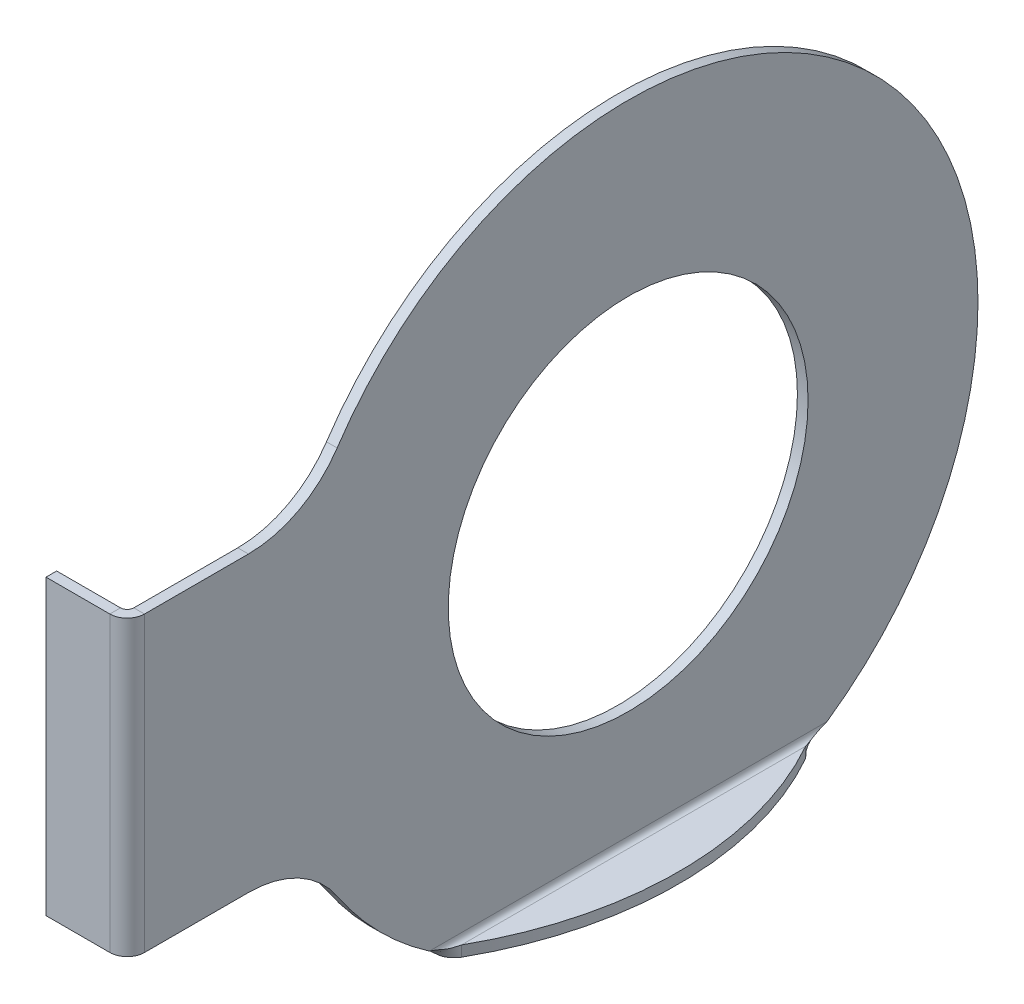
ISO-10303-21;
HEADER;
FILE_DESCRIPTION(('STEP AP214'),'2;1');
FILE_NAME('part.step','',(''),(''),'','','');
FILE_SCHEMA(('AUTOMOTIVE_DESIGN { 1 0 10303 214 1 1 1 1 }'));
ENDSEC;
DATA;
#1=APPLICATION_CONTEXT('core data for automotive mechanical design processes');
#2=APPLICATION_PROTOCOL_DEFINITION('international standard','automotive_design',2000,#1);
#3=PRODUCT_CONTEXT('',#1,'mechanical');
#4=PRODUCT('Part','Part','',(#3));
#5=PRODUCT_RELATED_PRODUCT_CATEGORY('part','',(#4));
#6=PRODUCT_DEFINITION_FORMATION('','',#4);
#7=PRODUCT_DEFINITION_CONTEXT('part definition',#1,'design');
#8=PRODUCT_DEFINITION('design','',#6,#7);
#9=PRODUCT_DEFINITION_SHAPE('','',#8);
#10=(LENGTH_UNIT() NAMED_UNIT(*) SI_UNIT(.MILLI.,.METRE.));
#11=(NAMED_UNIT(*) PLANE_ANGLE_UNIT() SI_UNIT($,.RADIAN.));
#12=(NAMED_UNIT(*) SI_UNIT($,.STERADIAN.) SOLID_ANGLE_UNIT());
#13=UNCERTAINTY_MEASURE_WITH_UNIT(LENGTH_MEASURE(1.E-05),#10,'distance_accuracy_value','');
#14=(GEOMETRIC_REPRESENTATION_CONTEXT(3) GLOBAL_UNCERTAINTY_ASSIGNED_CONTEXT((#13)) GLOBAL_UNIT_ASSIGNED_CONTEXT((#10,
#11,#12)) REPRESENTATION_CONTEXT('',''));
#15=CARTESIAN_POINT('',(0.,0.,0.));
#16=DIRECTION('',(0.,0.,1.));
#17=DIRECTION('',(1.,0.,0.));
#18=AXIS2_PLACEMENT_3D('',#15,#16,#17);
#19=CARTESIAN_POINT('',(0.,38.,56.9934206729163));
#20=DIRECTION('',(-1.,0.,0.));
#21=DIRECTION('',(0.,0.,1.));
#22=AXIS2_PLACEMENT_3D('',#19,#20,#21);
#23=PLANE('',#22);
#24=CARTESIAN_POINT('',(0.,0.,0.));
#25=DIRECTION('',(1.,0.,0.));
#26=DIRECTION('',(0.,0.,-1.));
#27=AXIS2_PLACEMENT_3D('',#24,#25,#26);
#28=CIRCLE('',#27,27.);
#29=CARTESIAN_POINT('',(0.,0.,-27.));
#30=VERTEX_POINT('',#29);
#31=EDGE_CURVE('E323',#30,#30,#28,.T.);
#32=ORIENTED_EDGE('',*,*,#31,.T.);
#33=EDGE_LOOP('',(#32));
#34=FACE_BOUND('',#33,.T.);
#35=DIRECTION('',(0.,0.,-1.));
#36=VECTOR('',#35,1.);
#37=CARTESIAN_POINT('',(0.,-22.,56.9934206729163));
#38=LINE('',#37,#36);
#39=CARTESIAN_POINT('',(0.,-22.,72.590498613805));
#40=VERTEX_POINT('',#39);
#41=CARTESIAN_POINT('',(0.,-22.,56.9934206729163));
#42=VERTEX_POINT('',#41);
#43=EDGE_CURVE('E73',#40,#42,#38,.T.);
#44=ORIENTED_EDGE('',*,*,#43,.F.);
#45=DIRECTION('',(0.,1.,0.));
#46=VECTOR('',#45,1.);
#47=CARTESIAN_POINT('',(0.,38.,72.590498613805));
#48=LINE('',#47,#46);
#49=CARTESIAN_POINT('',(0.,22.,72.590498613805));
#50=VERTEX_POINT('',#49);
#51=EDGE_CURVE('E65',#40,#50,#48,.T.);
#52=ORIENTED_EDGE('',*,*,#51,.T.);
#53=DIRECTION('',(0.,0.,1.));
#54=VECTOR('',#53,1.);
#55=CARTESIAN_POINT('',(0.,22.,56.9934206729163));
#56=LINE('',#55,#54);
#57=CARTESIAN_POINT('',(0.,22.,56.9934206729163));
#58=VERTEX_POINT('',#57);
#59=EDGE_CURVE('E81',#58,#50,#56,.T.);
#60=ORIENTED_EDGE('',*,*,#59,.F.);
#61=CARTESIAN_POINT('',(0.,38.,56.9934206729163));
#62=DIRECTION('',(-1.,0.,0.));
#63=DIRECTION('',(0.,0.,1.));
#64=AXIS2_PLACEMENT_3D('',#61,#62,#63);
#65=CIRCLE('',#64,16.);
#66=CARTESIAN_POINT('',(0.,29.1240875912409,43.6810888369066));
#67=VERTEX_POINT('',#66);
#68=EDGE_CURVE('E322',#67,#58,#65,.T.);
#69=ORIENTED_EDGE('',*,*,#68,.F.);
#70=CARTESIAN_POINT('',(0.,0.,0.));
#71=DIRECTION('',(1.,0.,0.));
#72=DIRECTION('',(0.,0.,-1.));
#73=AXIS2_PLACEMENT_3D('',#70,#71,#72);
#74=CIRCLE('',#73,52.5);
#75=CARTESIAN_POINT('',(0.,-43.1949484675754,-29.8403489738894));
#76=VERTEX_POINT('',#75);
#77=EDGE_CURVE('E338',#76,#67,#74,.T.);
#78=ORIENTED_EDGE('',*,*,#77,.F.);
#79=DIRECTION('',(0.,0.,1.));
#80=VECTOR('',#79,1.);
#81=CARTESIAN_POINT('',(0.,-43.1949484675745,56.9934206729171));
#82=LINE('',#81,#80);
#83=CARTESIAN_POINT('',(0.,-43.1949484675748,29.8403489738903));
#84=VERTEX_POINT('',#83);
#85=EDGE_CURVE('E393',#76,#84,#82,.T.);
#86=ORIENTED_EDGE('',*,*,#85,.T.);
#87=CARTESIAN_POINT('',(0.,-29.1240875912409,43.6810888369066));
#88=VERTEX_POINT('',#87);
#89=EDGE_CURVE('E330',#88,#84,#74,.T.);
#90=ORIENTED_EDGE('',*,*,#89,.F.);
#91=CARTESIAN_POINT('',(0.,-38.,56.9934206729163));
#92=DIRECTION('',(-1.,0.,0.));
#93=DIRECTION('',(0.,0.,-1.));
#94=AXIS2_PLACEMENT_3D('',#91,#92,#93);
#95=CIRCLE('',#94,16.);
#96=EDGE_CURVE('E336',#42,#88,#95,.T.);
#97=ORIENTED_EDGE('',*,*,#96,.F.);
#98=EDGE_LOOP('',(#44,#52,#60,#69,#78,#86,#90,#97));
#99=FACE_BOUND('',#98,.T.);
#100=ADVANCED_FACE('F56',(#34,#99),#23,.T.);
#101=CARTESIAN_POINT('',(1.6,0.,0.));
#102=DIRECTION('',(-1.,0.,0.));
#103=DIRECTION('',(0.,0.,1.));
#104=AXIS2_PLACEMENT_3D('',#101,#102,#103);
#105=CYLINDRICAL_SURFACE('',#104,52.5);
#106=CARTESIAN_POINT('',(1.6,-43.1949484675748,29.8403489738903));
#107=CARTESIAN_POINT('',(0.,-43.1949484675748,29.8403489738903));
#108=B_SPLINE_CURVE_WITH_KNOTS('',1,(#106,#107),.UNSPECIFIED.,.F.,.F.,(2,2),(0.,1.),.UNSPECIFIED.);
#109=CARTESIAN_POINT('',(1.6,-43.1949484675748,29.8403489738903));
#110=VERTEX_POINT('',#109);
#111=EDGE_CURVE('E310',#110,#84,#108,.T.);
#112=ORIENTED_EDGE('',*,*,#111,.F.);
#113=CARTESIAN_POINT('',(1.6,0.,0.));
#114=DIRECTION('',(1.,0.,0.));
#115=DIRECTION('',(0.,0.,-1.));
#116=AXIS2_PLACEMENT_3D('',#113,#114,#115);
#117=CIRCLE('',#116,52.5);
#118=CARTESIAN_POINT('',(1.6,-29.1240875912409,43.6810888369066));
#119=VERTEX_POINT('',#118);
#120=EDGE_CURVE('E343',#119,#110,#117,.T.);
#121=ORIENTED_EDGE('',*,*,#120,.F.);
#122=DIRECTION('',(-1.,0.,0.));
#123=VECTOR('',#122,1.);
#124=CARTESIAN_POINT('',(1.6,-29.1240875912409,43.6810888369066));
#125=LINE('',#124,#123);
#126=EDGE_CURVE('E342',#119,#88,#125,.T.);
#127=ORIENTED_EDGE('',*,*,#126,.T.);
#128=ORIENTED_EDGE('',*,*,#89,.T.);
#129=EDGE_LOOP('',(#112,#121,#127,#128));
#130=FACE_BOUND('',#129,.T.);
#131=ADVANCED_FACE('F381',(#130),#105,.T.);
#132=CARTESIAN_POINT('',(1.6,38.,56.9934206729163));
#133=DIRECTION('',(-1.,0.,0.));
#134=DIRECTION('',(0.,0.,1.));
#135=AXIS2_PLACEMENT_3D('',#132,#133,#134);
#136=PLANE('',#135);
#137=DIRECTION('',(0.,1.,0.));
#138=VECTOR('',#137,1.);
#139=CARTESIAN_POINT('',(1.6,38.,72.590498613805));
#140=LINE('',#139,#138);
#141=CARTESIAN_POINT('',(1.6,-22.,72.590498613805));
#142=VERTEX_POINT('',#141);
#143=CARTESIAN_POINT('',(1.6,22.,72.590498613805));
#144=VERTEX_POINT('',#143);
#145=EDGE_CURVE('E404',#142,#144,#140,.T.);
#146=ORIENTED_EDGE('',*,*,#145,.F.);
#147=DIRECTION('',(0.,0.,-1.));
#148=VECTOR('',#147,1.);
#149=CARTESIAN_POINT('',(1.6,-22.,56.9934206729163));
#150=LINE('',#149,#148);
#151=CARTESIAN_POINT('',(1.6,-22.,56.9934206729163));
#152=VERTEX_POINT('',#151);
#153=EDGE_CURVE('E60',#142,#152,#150,.T.);
#154=ORIENTED_EDGE('',*,*,#153,.T.);
#155=CARTESIAN_POINT('',(1.6,-38.,56.9934206729163));
#156=DIRECTION('',(-1.,0.,0.));
#157=DIRECTION('',(0.,0.,-1.));
#158=AXIS2_PLACEMENT_3D('',#155,#156,#157);
#159=CIRCLE('',#158,16.);
#160=EDGE_CURVE('E331',#152,#119,#159,.T.);
#161=ORIENTED_EDGE('',*,*,#160,.T.);
#162=ORIENTED_EDGE('',*,*,#120,.T.);
#163=DIRECTION('',(0.,0.,1.));
#164=VECTOR('',#163,1.);
#165=CARTESIAN_POINT('',(1.6,-43.1949484675745,56.9934206729171));
#166=LINE('',#165,#164);
#167=CARTESIAN_POINT('',(1.6,-43.1949484675754,-29.8403489738894));
#168=VERTEX_POINT('',#167);
#169=EDGE_CURVE('E351',#168,#110,#166,.T.);
#170=ORIENTED_EDGE('',*,*,#169,.F.);
#171=CARTESIAN_POINT('',(1.6,29.1240875912409,43.6810888369066));
#172=VERTEX_POINT('',#171);
#173=EDGE_CURVE('E333',#168,#172,#117,.T.);
#174=ORIENTED_EDGE('',*,*,#173,.T.);
#175=CARTESIAN_POINT('',(1.6,38.,56.9934206729163));
#176=DIRECTION('',(-1.,0.,0.));
#177=DIRECTION('',(0.,0.,1.));
#178=AXIS2_PLACEMENT_3D('',#175,#176,#177);
#179=CIRCLE('',#178,16.);
#180=CARTESIAN_POINT('',(1.6,22.,56.9934206729163));
#181=VERTEX_POINT('',#180);
#182=EDGE_CURVE('E326',#172,#181,#179,.T.);
#183=ORIENTED_EDGE('',*,*,#182,.T.);
#184=DIRECTION('',(0.,0.,1.));
#185=VECTOR('',#184,1.);
#186=CARTESIAN_POINT('',(1.6,22.,56.9934206729163));
#187=LINE('',#186,#185);
#188=EDGE_CURVE('E329',#181,#144,#187,.T.);
#189=ORIENTED_EDGE('',*,*,#188,.T.);
#190=EDGE_LOOP('',(#146,#154,#161,#162,#170,#174,#183,#189));
#191=FACE_BOUND('',#190,.T.);
#192=CARTESIAN_POINT('',(1.6,0.,0.));
#193=DIRECTION('',(1.,0.,0.));
#194=DIRECTION('',(0.,0.,-1.));
#195=AXIS2_PLACEMENT_3D('',#192,#193,#194);
#196=CIRCLE('',#195,27.);
#197=CARTESIAN_POINT('',(1.6,0.,-27.));
#198=VERTEX_POINT('',#197);
#199=EDGE_CURVE('E314',#198,#198,#196,.T.);
#200=ORIENTED_EDGE('',*,*,#199,.F.);
#201=EDGE_LOOP('',(#200));
#202=FACE_BOUND('',#201,.T.);
#203=ADVANCED_FACE('F383',(#191,#202),#136,.F.);
#204=CARTESIAN_POINT('',(1.6,38.,56.9934206729163));
#205=DIRECTION('',(-1.,0.,0.));
#206=DIRECTION('',(0.,0.,1.));
#207=AXIS2_PLACEMENT_3D('',#204,#205,#206);
#208=CYLINDRICAL_SURFACE('',#207,16.);
#209=ORIENTED_EDGE('',*,*,#68,.T.);
#210=DIRECTION('',(-1.,0.,0.));
#211=VECTOR('',#210,1.);
#212=CARTESIAN_POINT('',(1.6,22.,56.9934206729163));
#213=LINE('',#212,#211);
#214=EDGE_CURVE('E349',#181,#58,#213,.T.);
#215=ORIENTED_EDGE('',*,*,#214,.F.);
#216=ORIENTED_EDGE('',*,*,#182,.F.);
#217=DIRECTION('',(-1.,0.,0.));
#218=VECTOR('',#217,1.);
#219=CARTESIAN_POINT('',(1.6,29.1240875912409,43.6810888369066));
#220=LINE('',#219,#218);
#221=EDGE_CURVE('E339',#172,#67,#220,.T.);
#222=ORIENTED_EDGE('',*,*,#221,.T.);
#223=EDGE_LOOP('',(#209,#215,#216,#222));
#224=FACE_BOUND('',#223,.T.);
#225=ADVANCED_FACE('F382',(#224),#208,.F.);
#226=CARTESIAN_POINT('',(1.6,22.,56.9934206729163));
#227=DIRECTION('',(0.,-1.,0.));
#228=DIRECTION('',(0.,0.,-1.));
#229=AXIS2_PLACEMENT_3D('',#226,#227,#228);
#230=PLANE('',#229);
#231=DIRECTION('',(-1.,0.,0.));
#232=VECTOR('',#231,1.);
#233=CARTESIAN_POINT('',(1.6,22.,72.590498613805));
#234=LINE('',#233,#232);
#235=EDGE_CURVE('E424',#144,#50,#234,.T.);
#236=ORIENTED_EDGE('',*,*,#235,.F.);
#237=ORIENTED_EDGE('',*,*,#188,.F.);
#238=ORIENTED_EDGE('',*,*,#214,.T.);
#239=ORIENTED_EDGE('',*,*,#59,.T.);
#240=EDGE_LOOP('',(#236,#237,#238,#239));
#241=FACE_BOUND('',#240,.T.);
#242=ADVANCED_FACE('F535',(#241),#230,.F.);
#243=CARTESIAN_POINT('',(1.6,-22.,56.9934206729163));
#244=DIRECTION('',(0.,1.,0.));
#245=DIRECTION('',(0.,0.,1.));
#246=AXIS2_PLACEMENT_3D('',#243,#244,#245);
#247=PLANE('',#246);
#248=DIRECTION('',(1.,0.,0.));
#249=VECTOR('',#248,1.);
#250=CARTESIAN_POINT('',(1.6,-22.,72.590498613805));
#251=LINE('',#250,#249);
#252=EDGE_CURVE('E12',#40,#142,#251,.T.);
#253=ORIENTED_EDGE('',*,*,#252,.F.);
#254=ORIENTED_EDGE('',*,*,#43,.T.);
#255=DIRECTION('',(-1.,0.,0.));
#256=VECTOR('',#255,1.);
#257=CARTESIAN_POINT('',(1.6,-22.,56.9934206729163));
#258=LINE('',#257,#256);
#259=EDGE_CURVE('E346',#152,#42,#258,.T.);
#260=ORIENTED_EDGE('',*,*,#259,.F.);
#261=ORIENTED_EDGE('',*,*,#153,.F.);
#262=EDGE_LOOP('',(#253,#254,#260,#261));
#263=FACE_BOUND('',#262,.T.);
#264=ADVANCED_FACE('F58',(#263),#247,.F.);
#265=CARTESIAN_POINT('',(1.6,-38.,56.9934206729163));
#266=DIRECTION('',(-1.,0.,0.));
#267=DIRECTION('',(0.,0.,1.));
#268=AXIS2_PLACEMENT_3D('',#265,#266,#267);
#269=CYLINDRICAL_SURFACE('',#268,16.);
#270=ORIENTED_EDGE('',*,*,#96,.T.);
#271=ORIENTED_EDGE('',*,*,#126,.F.);
#272=ORIENTED_EDGE('',*,*,#160,.F.);
#273=ORIENTED_EDGE('',*,*,#259,.T.);
#274=EDGE_LOOP('',(#270,#271,#272,#273));
#275=FACE_BOUND('',#274,.T.);
#276=ADVANCED_FACE('F379',(#275),#269,.F.);
#277=CARTESIAN_POINT('',(0.,-43.1949484675754,-29.8403489738894));
#278=CARTESIAN_POINT('',(1.6,-43.1949484675754,-29.8403489738894));
#279=B_SPLINE_CURVE_WITH_KNOTS('',1,(#277,#278),.UNSPECIFIED.,.F.,.F.,(2,2),(0.,1.),.UNSPECIFIED.);
#280=EDGE_CURVE('E400',#76,#168,#279,.T.);
#281=ORIENTED_EDGE('',*,*,#280,.F.);
#282=ORIENTED_EDGE('',*,*,#77,.T.);
#283=ORIENTED_EDGE('',*,*,#221,.F.);
#284=ORIENTED_EDGE('',*,*,#173,.F.);
#285=EDGE_LOOP('',(#281,#282,#283,#284));
#286=FACE_BOUND('',#285,.T.);
#287=ADVANCED_FACE('F369',(#286),#105,.T.);
#288=CARTESIAN_POINT('',(1.6,0.,0.));
#289=DIRECTION('',(-1.,0.,0.));
#290=DIRECTION('',(0.,0.,1.));
#291=AXIS2_PLACEMENT_3D('',#288,#289,#290);
#292=CYLINDRICAL_SURFACE('',#291,27.);
#293=ORIENTED_EDGE('',*,*,#199,.T.);
#294=EDGE_LOOP('',(#293));
#295=FACE_BOUND('',#294,.T.);
#296=ORIENTED_EDGE('',*,*,#31,.F.);
#297=EDGE_LOOP('',(#296));
#298=FACE_BOUND('',#297,.T.);
#299=ADVANCED_FACE('F284',(#295,#298),#292,.F.);
#300=CARTESIAN_POINT('',(2.39999999999999,-45.5949484675754,-25.8265055247924));
#301=CARTESIAN_POINT('',(2.08581418695435,-45.5949484675754,-26.1610207443396));
#302=CARTESIAN_POINT('',(1.77180507753771,-45.5324828915794,-26.4954794329752));
#303=CARTESIAN_POINT('',(1.19131444710983,-45.2920357996256,-27.164453341158));
#304=CARTESIAN_POINT('',(0.925087872060189,-45.114148889331,-27.4989402952495));
#305=CARTESIAN_POINT('',(0.480799578244354,-44.6698605955152,-28.1679142034323));
#306=CARTESIAN_POINT('',(0.302912667949769,-44.4036340204656,-28.5024011575237));
#307=CARTESIAN_POINT('',(0.0624655759960359,-43.8231433900377,-29.1713750657066));
#308=CARTESIAN_POINT('',(0.,-43.5091342806211,-29.5058337543421));
#309=CARTESIAN_POINT('',(0.,-43.1949484675754,-29.8403489738894));
#310=CARTESIAN_POINT('',(2.4,-43.9949484675754,-25.8265055247924));
#311=CARTESIAN_POINT('',(2.2952785594616,-43.9949484675754,-26.1609978623053));
#312=CARTESIAN_POINT('',(2.19060169251257,-43.9741266089101,-26.4954794329752));
#313=CARTESIAN_POINT('',(1.99710481570328,-43.8939775782588,-27.1644533411581));
#314=CARTESIAN_POINT('',(1.90836262402006,-43.834681941494,-27.4989402952495));
#315=CARTESIAN_POINT('',(1.76026652608145,-43.6865858435553,-28.1679142034323));
#316=CARTESIAN_POINT('',(1.70097088931659,-43.5978436518721,-28.5024011575237));
#317=CARTESIAN_POINT('',(1.62082185866535,-43.4043467750628,-29.1713750657066));
#318=CARTESIAN_POINT('',(1.6,-43.2996699081138,-29.5058566363765));
#319=CARTESIAN_POINT('',(1.6,-43.1949484675754,-29.8403489738894));
#320=B_SPLINE_SURFACE_WITH_KNOTS('',1,3,((#300,#301,#302,#303,#304,#305,#306,#307,#308,#309),
(#310,#311,#312,#313,#314,#315,#316,#317,#318,#319)),.UNSPECIFIED.,.F.,.F.,.F.,(2,2),(4,2,2,2,
4),(0.,1.),(0.,0.25,0.5,0.75,1.),.UNSPECIFIED.);
#321=CARTESIAN_POINT('',(2.4,-43.9949484675754,-25.8265055247924));
#322=CARTESIAN_POINT('',(2.39999999999999,-45.5949484675754,-25.8265055247924));
#323=B_SPLINE_CURVE_WITH_KNOTS('',1,(#321,#322),.UNSPECIFIED.,.F.,.F.,(2,2),(0.,1.),.UNSPECIFIED.);
#324=CARTESIAN_POINT('',(2.40000000000001,-45.5949484675754,-25.8265055247924));
#325=VERTEX_POINT('',#324);
#326=CARTESIAN_POINT('',(2.4,-43.9949484675754,-25.8265055247924));
#327=VERTEX_POINT('',#326);
#328=EDGE_CURVE('E491',#325,#327,#323,.F.);
#329=CARTESIAN_POINT('',(2.39999999999999,-45.5949484675754,-25.8265055247924));
#330=CARTESIAN_POINT('',(2.08581418695435,-45.5949484675754,-26.1610207443396));
#331=CARTESIAN_POINT('',(1.77180507753771,-45.5324828915794,-26.4954794329752));
#332=CARTESIAN_POINT('',(1.19131444710983,-45.2920357996256,-27.164453341158));
#333=CARTESIAN_POINT('',(0.925087872060189,-45.114148889331,-27.4989402952495));
#334=CARTESIAN_POINT('',(0.480799578244354,-44.6698605955152,-28.1679142034323));
#335=CARTESIAN_POINT('',(0.302912667949769,-44.4036340204656,-28.5024011575237));
#336=CARTESIAN_POINT('',(0.0624655759960359,-43.8231433900377,-29.1713750657066));
#337=CARTESIAN_POINT('',(0.,-43.5091342806211,-29.5058337543421));
#338=CARTESIAN_POINT('',(0.,-43.1949484675754,-29.8403489738894));
#339=B_SPLINE_CURVE_WITH_KNOTS('',3,(#329,#330,#331,#332,#333,#334,#335,#336,#337,#338),
.UNSPECIFIED.,.F.,.F.,(4,2,2,2,4),(0.,0.25,0.5,0.75,1.),.UNSPECIFIED.);
#340=EDGE_CURVE('E495',#325,#76,#339,.T.);
#341=CARTESIAN_POINT('',(1.6,-43.1949484675754,-29.8403489738894));
#342=CARTESIAN_POINT('',(1.6,-43.2996699081138,-29.5058566363765));
#343=CARTESIAN_POINT('',(1.62082185866535,-43.4043467750628,-29.1713750657066));
#344=CARTESIAN_POINT('',(1.70097088931659,-43.5978436518721,-28.5024011575237));
#345=CARTESIAN_POINT('',(1.76026652608145,-43.6865858435553,-28.1679142034323));
#346=CARTESIAN_POINT('',(1.90836262402006,-43.834681941494,-27.4989402952495));
#347=CARTESIAN_POINT('',(1.99710481570328,-43.8939775782588,-27.1644533411581));
#348=CARTESIAN_POINT('',(2.19060169251257,-43.9741266089101,-26.4954794329752));
#349=CARTESIAN_POINT('',(2.2952785594616,-43.9949484675754,-26.1609978623053));
#350=CARTESIAN_POINT('',(2.4,-43.9949484675754,-25.8265055247924));
#351=B_SPLINE_CURVE_WITH_KNOTS('',3,(#341,#342,#343,#344,#345,#346,#347,#348,#349,#350),
.UNSPECIFIED.,.F.,.F.,(4,2,2,2,4),(0.,0.25,0.5,0.75,1.),.UNSPECIFIED.);
#352=EDGE_CURVE('E505',#327,#168,#351,.F.);
#353=ORIENTED_EDGE('',*,*,#328,.F.);
#354=ORIENTED_EDGE('',*,*,#340,.T.);
#355=ORIENTED_EDGE('',*,*,#280,.T.);
#356=ORIENTED_EDGE('',*,*,#352,.F.);
#357=EDGE_LOOP('',(#353,#354,#355,#356));
#358=FACE_BOUND('',#357,.T.);
#359=ADVANCED_FACE('F280',(#358),#320,.F.);
#360=CARTESIAN_POINT('',(0.,-43.1949484675748,29.8403489738903));
#361=CARTESIAN_POINT('',(0.,-43.5431796008379,29.4564046046059));
#362=CARTESIAN_POINT('',(0.076945603504657,-43.8911191876443,29.097279009771));
#363=CARTESIAN_POINT('',(0.297152798945562,-44.3647101950891,28.5956071010071));
#364=CARTESIAN_POINT('',(0.387796927702842,-44.514549797444,28.4345643052331));
#365=CARTESIAN_POINT('',(0.546428936659275,-44.7219885887356,28.2022718722931));
#366=CARTESIAN_POINT('',(0.603071730640237,-44.7882550972734,28.1263863547666));
#367=CARTESIAN_POINT('',(0.693182040119206,-44.8827478505569,28.014876018657));
#368=CARTESIAN_POINT('',(0.724075823840003,-44.9134281623926,27.9780922299839));
#369=CARTESIAN_POINT('',(0.771633470285655,-44.9581546442146,27.9234960320192));
#370=CARTESIAN_POINT('',(0.787688808778053,-44.9728478458135,27.9053938802052));
#371=CARTESIAN_POINT('',(0.812067091795537,-44.9945560562345,27.8783855237454));
#372=CARTESIAN_POINT('',(0.820242396363829,-45.0017368635636,27.869406883469));
#373=CARTESIAN_POINT('',(0.832578034329629,-45.0124241840744,27.8559751408697));
#374=CARTESIAN_POINT('',(0.83670202702908,-45.015972642658,27.8515039296392));
#375=CARTESIAN_POINT('',(0.844974048460047,-45.0230414325439,27.8425735797832));
#376=CARTESIAN_POINT('',(0.849935198854595,-45.0272470979085,27.8372440188581));
#377=CARTESIAN_POINT('',(1.06747909466519,-45.2106024905944,27.6043698173511));
#378=CARTESIAN_POINT('',(1.31354979964119,-45.3532113478243,27.3224610721057));
#379=CARTESIAN_POINT('',(1.83981127021119,-45.5454082704943,26.6534091340918));
#380=CARTESIAN_POINT('',(2.11986170524636,-45.5949484675749,26.2662804319928));
#381=CARTESIAN_POINT('',(2.39999999999999,-45.5949484675749,25.8265055247933));
#382=CARTESIAN_POINT('',(1.6,-43.1949484675748,29.8403489738903));
#383=CARTESIAN_POINT('',(1.6,-43.3110139294419,29.4564429158532));
#384=CARTESIAN_POINT('',(1.62564853450155,-43.4270053742647,29.097279009771));
#385=CARTESIAN_POINT('',(1.69905093298185,-43.5848690434129,28.5956071010071));
#386=CARTESIAN_POINT('',(1.72926564256761,-43.6348155775312,28.4345643052331));
#387=CARTESIAN_POINT('',(1.78214297888643,-43.7039618412951,28.2022718722931));
#388=CARTESIAN_POINT('',(1.80102391021341,-43.7260506774743,28.1263863547666));
#389=CARTESIAN_POINT('',(1.83106068003973,-43.7575482619022,28.014876018657));
#390=CARTESIAN_POINT('',(1.84135860794667,-43.7677750325141,27.9780922299839));
#391=CARTESIAN_POINT('',(1.85721115676188,-43.7826838597881,27.9234960320192));
#392=CARTESIAN_POINT('',(1.86256293625935,-43.7875815936544,27.9053938802052));
#393=CARTESIAN_POINT('',(1.87068903059851,-43.7948176637947,27.8783855237454));
#394=CARTESIAN_POINT('',(1.87341413212128,-43.7972112662378,27.869406883469));
#395=CARTESIAN_POINT('',(1.87752601144321,-43.800773706408,27.8559751408697));
#396=CARTESIAN_POINT('',(1.87890067567636,-43.8019565259359,27.8515039296392));
#397=CARTESIAN_POINT('',(1.88165801615335,-43.8043127892312,27.8425735797832));
#398=CARTESIAN_POINT('',(1.88331173295153,-43.8057146776861,27.8372440188581));
#399=CARTESIAN_POINT('',(1.9558263648884,-43.8668331419147,27.6043698173511));
#400=CARTESIAN_POINT('',(2.03784993321373,-43.914369427658,27.3224610721057));
#401=CARTESIAN_POINT('',(2.21327042340373,-43.978435068548,26.6534091340918));
#402=CARTESIAN_POINT('',(2.30662318542125,-43.9949484675749,26.2662681070786));
#403=CARTESIAN_POINT('',(2.4,-43.9949484675749,25.8265055247933));
#404=B_SPLINE_SURFACE_WITH_KNOTS('',1,3,((#360,#361,#362,#363,#364,#365,#366,#367,#368,#369,
#370,#371,#372,#373,#374,#375,#376,#377,#378,#379,#380,#381),(#382,#383,#384,#385,#386,#387,
#388,#389,#390,#391,#392,#393,#394,#395,#396,#397,#398,#399,#400,#401,#402,#403)),.UNSPECIFIED.,
.F.,.F.,.F.,(2,2),(4,2,2,2,2,2,2,2,2,2,4),(0.,1.),(0.,0.25,0.375,0.4375,0.46875,0.484375,
0.4921875,0.49609375,0.5,0.75,1.),.UNSPECIFIED.);
#405=CARTESIAN_POINT('',(0.,-43.1949484675748,29.8403489738903));
#406=CARTESIAN_POINT('',(0.,-43.5431796008379,29.4564046046059));
#407=CARTESIAN_POINT('',(0.076945603504657,-43.8911191876443,29.097279009771));
#408=CARTESIAN_POINT('',(0.297152798945562,-44.3647101950891,28.5956071010071));
#409=CARTESIAN_POINT('',(0.387796927702842,-44.514549797444,28.4345643052331));
#410=CARTESIAN_POINT('',(0.546428936659275,-44.7219885887356,28.2022718722931));
#411=CARTESIAN_POINT('',(0.603071730640237,-44.7882550972734,28.1263863547666));
#412=CARTESIAN_POINT('',(0.693182040119206,-44.8827478505569,28.014876018657));
#413=CARTESIAN_POINT('',(0.724075823840003,-44.9134281623926,27.9780922299839));
#414=CARTESIAN_POINT('',(0.771633470285655,-44.9581546442146,27.9234960320192));
#415=CARTESIAN_POINT('',(0.787688808778053,-44.9728478458135,27.9053938802052));
#416=CARTESIAN_POINT('',(0.812067091795537,-44.9945560562345,27.8783855237454));
#417=CARTESIAN_POINT('',(0.820242396363829,-45.0017368635636,27.869406883469));
#418=CARTESIAN_POINT('',(0.832578034329629,-45.0124241840744,27.8559751408697));
#419=CARTESIAN_POINT('',(0.83670202702908,-45.015972642658,27.8515039296392));
#420=CARTESIAN_POINT('',(0.844974048460047,-45.0230414325439,27.8425735797832));
#421=CARTESIAN_POINT('',(0.849935198854595,-45.0272470979085,27.8372440188581));
#422=CARTESIAN_POINT('',(1.06747909466519,-45.2106024905944,27.6043698173511));
#423=CARTESIAN_POINT('',(1.31354979964119,-45.3532113478243,27.3224610721057));
#424=CARTESIAN_POINT('',(1.83981127021119,-45.5454082704943,26.6534091340918));
#425=CARTESIAN_POINT('',(2.11986170524636,-45.5949484675749,26.2662804319928));
#426=CARTESIAN_POINT('',(2.39999999999999,-45.5949484675749,25.8265055247933));
#427=B_SPLINE_CURVE_WITH_KNOTS('',3,(#405,#406,#407,#408,#409,#410,#411,#412,#413,#414,#415,
#416,#417,#418,#419,#420,#421,#422,#423,#424,#425,#426),.UNSPECIFIED.,.F.,.F.,(4,2,2,2,2,2,2,2,
2,2,4),(0.,0.25,0.375,0.4375,0.46875,0.484375,0.4921875,0.49609375,0.5,0.75,1.),.UNSPECIFIED.);
#428=CARTESIAN_POINT('',(2.40000000000001,-45.5949484675748,25.8265055247933));
#429=VERTEX_POINT('',#428);
#430=EDGE_CURVE('E252',#84,#429,#427,.T.);
#431=CARTESIAN_POINT('',(2.39999999999999,-45.5949484675749,25.8265055247933));
#432=CARTESIAN_POINT('',(2.4,-43.9949484675749,25.8265055247933));
#433=B_SPLINE_CURVE_WITH_KNOTS('',1,(#431,#432),.UNSPECIFIED.,.F.,.F.,(2,2),(0.,1.),.UNSPECIFIED.);
#434=CARTESIAN_POINT('',(2.40000000000001,-43.9949484675748,25.8265055247933));
#435=VERTEX_POINT('',#434);
#436=EDGE_CURVE('E492',#435,#429,#433,.F.);
#437=CARTESIAN_POINT('',(2.4,-43.9949484675749,25.8265055247933));
#438=CARTESIAN_POINT('',(2.30662318542125,-43.9949484675749,26.2662681070786));
#439=CARTESIAN_POINT('',(2.21327042340373,-43.978435068548,26.6534091340918));
#440=CARTESIAN_POINT('',(2.03784993321373,-43.914369427658,27.3224610721057));
#441=CARTESIAN_POINT('',(1.9558263648884,-43.8668331419147,27.6043698173511));
#442=CARTESIAN_POINT('',(1.88331173295153,-43.8057146776861,27.8372440188581));
#443=CARTESIAN_POINT('',(1.88165801615335,-43.8043127892312,27.8425735797832));
#444=CARTESIAN_POINT('',(1.87890067567636,-43.8019565259359,27.8515039296392));
#445=CARTESIAN_POINT('',(1.87752601144321,-43.800773706408,27.8559751408697));
#446=CARTESIAN_POINT('',(1.87341413212128,-43.7972112662378,27.869406883469));
#447=CARTESIAN_POINT('',(1.87068903059851,-43.7948176637947,27.8783855237454));
#448=CARTESIAN_POINT('',(1.86256293625935,-43.7875815936544,27.9053938802052));
#449=CARTESIAN_POINT('',(1.85721115676188,-43.7826838597881,27.9234960320192));
#450=CARTESIAN_POINT('',(1.84135860794667,-43.7677750325141,27.9780922299839));
#451=CARTESIAN_POINT('',(1.83106068003973,-43.7575482619022,28.014876018657));
#452=CARTESIAN_POINT('',(1.80102391021341,-43.7260506774743,28.1263863547666));
#453=CARTESIAN_POINT('',(1.78214297888643,-43.7039618412951,28.2022718722931));
#454=CARTESIAN_POINT('',(1.72926564256761,-43.6348155775312,28.4345643052331));
#455=CARTESIAN_POINT('',(1.69905093298185,-43.5848690434129,28.5956071010071));
#456=CARTESIAN_POINT('',(1.62564853450155,-43.4270053742647,29.097279009771));
#457=CARTESIAN_POINT('',(1.6,-43.3110139294419,29.4564429158532));
#458=CARTESIAN_POINT('',(1.6,-43.1949484675748,29.8403489738903));
#459=B_SPLINE_CURVE_WITH_KNOTS('',3,(#437,#438,#439,#440,#441,#442,#443,#444,#445,#446,#447,
#448,#449,#450,#451,#452,#453,#454,#455,#456,#457,#458),.UNSPECIFIED.,.F.,.F.,(4,2,2,2,2,2,2,2,
2,2,4),(0.,0.25,0.5,0.50390625,0.5078125,0.515625,0.53125,0.5625,0.625,0.75,1.),.UNSPECIFIED.);
#460=EDGE_CURVE('E245',#110,#435,#459,.F.);
#461=ORIENTED_EDGE('',*,*,#430,.T.);
#462=ORIENTED_EDGE('',*,*,#436,.F.);
#463=ORIENTED_EDGE('',*,*,#460,.F.);
#464=ORIENTED_EDGE('',*,*,#111,.T.);
#465=EDGE_LOOP('',(#461,#462,#463,#464));
#466=FACE_BOUND('',#465,.T.);
#467=ADVANCED_FACE('F220',(#466),#404,.F.);
#468=CARTESIAN_POINT('',(2.4,-43.1949484675745,59.7550186540919));
#469=DIRECTION('',(0.,0.,-1.));
#470=DIRECTION('',(0.,1.,0.));
#471=AXIS2_PLACEMENT_3D('',#468,#469,#470);
#472=CYLINDRICAL_SURFACE('',#471,0.8);
#473=ORIENTED_EDGE('',*,*,#169,.T.);
#474=ORIENTED_EDGE('',*,*,#460,.T.);
#475=DIRECTION('',(0.,0.,1.));
#476=VECTOR('',#475,1.);
#477=CARTESIAN_POINT('',(2.40000000000001,-43.9949484675745,56.9934206729171));
#478=LINE('',#477,#476);
#479=EDGE_CURVE('E496',#327,#435,#478,.T.);
#480=ORIENTED_EDGE('',*,*,#479,.F.);
#481=ORIENTED_EDGE('',*,*,#352,.T.);
#482=EDGE_LOOP('',(#473,#474,#480,#481));
#483=FACE_BOUND('',#482,.T.);
#484=ADVANCED_FACE('F209',(#483),#472,.F.);
#485=CARTESIAN_POINT('',(2.4,-43.1949484675745,59.7550186540919));
#486=DIRECTION('',(0.,0.,-1.));
#487=DIRECTION('',(0.,1.,0.));
#488=AXIS2_PLACEMENT_3D('',#485,#486,#487);
#489=CYLINDRICAL_SURFACE('',#488,2.4);
#490=ORIENTED_EDGE('',*,*,#85,.F.);
#491=ORIENTED_EDGE('',*,*,#340,.F.);
#492=DIRECTION('',(0.,0.,1.));
#493=VECTOR('',#492,1.);
#494=CARTESIAN_POINT('',(2.40000000000001,-45.5949484675745,56.9934206729172));
#495=LINE('',#494,#493);
#496=EDGE_CURVE('E196',#325,#429,#495,.T.);
#497=ORIENTED_EDGE('',*,*,#496,.T.);
#498=ORIENTED_EDGE('',*,*,#430,.F.);
#499=EDGE_LOOP('',(#490,#491,#497,#498));
#500=FACE_BOUND('',#499,.T.);
#501=ADVANCED_FACE('F219',(#500),#489,.T.);
#502=CARTESIAN_POINT('',(-81.3082225904463,-43.9949484675748,56.9934206729171));
#503=DIRECTION('',(0.,-1.,0.));
#504=DIRECTION('',(0.,0.,1.));
#505=AXIS2_PLACEMENT_3D('',#502,#503,#504);
#506=PLANE('',#505);
#507=CARTESIAN_POINT('',(-43.3082225904469,-43.9949484675753,4.58571788771344E-13));
#508=DIRECTION('',(0.,1.,0.));
#509=DIRECTION('',(0.,0.,-1.));
#510=AXIS2_PLACEMENT_3D('',#507,#508,#509);
#511=CIRCLE('',#510,52.5);
#512=EDGE_CURVE('E487',#435,#327,#511,.T.);
#513=ORIENTED_EDGE('',*,*,#512,.T.);
#514=ORIENTED_EDGE('',*,*,#479,.T.);
#515=EDGE_LOOP('',(#513,#514));
#516=FACE_BOUND('',#515,.T.);
#517=ADVANCED_FACE('F470',(#516),#506,.F.);
#518=CARTESIAN_POINT('',(-43.3082225904469,-43.9949484675753,4.58571788771344E-13));
#519=DIRECTION('',(0.,-1.,0.));
#520=DIRECTION('',(0.,0.,1.));
#521=AXIS2_PLACEMENT_3D('',#518,#519,#520);
#522=CYLINDRICAL_SURFACE('',#521,52.5);
#523=ORIENTED_EDGE('',*,*,#512,.F.);
#524=ORIENTED_EDGE('',*,*,#436,.T.);
#525=CARTESIAN_POINT('',(-43.3082225904469,-45.5949484675753,4.75314232417645E-13));
#526=DIRECTION('',(0.,1.,0.));
#527=DIRECTION('',(0.,0.,-1.));
#528=AXIS2_PLACEMENT_3D('',#525,#526,#527);
#529=CIRCLE('',#528,52.5);
#530=EDGE_CURVE('E490',#429,#325,#529,.T.);
#531=ORIENTED_EDGE('',*,*,#530,.T.);
#532=ORIENTED_EDGE('',*,*,#328,.T.);
#533=EDGE_LOOP('',(#523,#524,#531,#532));
#534=FACE_BOUND('',#533,.T.);
#535=ADVANCED_FACE('F461',(#534),#522,.T.);
#536=CARTESIAN_POINT('',(-81.3082225904463,-45.5949484675748,56.9934206729172));
#537=DIRECTION('',(0.,-1.,0.));
#538=DIRECTION('',(0.,0.,1.));
#539=AXIS2_PLACEMENT_3D('',#536,#537,#538);
#540=PLANE('',#539);
#541=ORIENTED_EDGE('',*,*,#496,.F.);
#542=ORIENTED_EDGE('',*,*,#530,.F.);
#543=EDGE_LOOP('',(#541,#542));
#544=FACE_BOUND('',#543,.T.);
#545=ADVANCED_FACE('F222',(#544),#540,.T.);
#546=CARTESIAN_POINT('',(-1.,-22.,72.590498613805));
#547=DIRECTION('',(0.,-1.,0.));
#548=DIRECTION('',(0.,0.,-1.));
#549=AXIS2_PLACEMENT_3D('',#546,#547,#548);
#550=PLANE('',#549);
#551=DIRECTION('',(0.,0.,1.));
#552=VECTOR('',#551,1.);
#553=CARTESIAN_POINT('',(-1.00000000000001,-22.,75.190498613805));
#554=LINE('',#553,#552);
#555=CARTESIAN_POINT('',(-1.00000000000001,-22.,73.590498613805));
#556=VERTEX_POINT('',#555);
#557=CARTESIAN_POINT('',(-1.00000000000002,-22.,75.190498613805));
#558=VERTEX_POINT('',#557);
#559=EDGE_CURVE('E443',#556,#558,#554,.T.);
#560=ORIENTED_EDGE('',*,*,#559,.F.);
#561=CARTESIAN_POINT('',(-1.,-22.,72.590498613805));
#562=DIRECTION('',(0.,-1.,0.));
#563=DIRECTION('',(0.,0.,-1.));
#564=AXIS2_PLACEMENT_3D('',#561,#562,#563);
#565=CIRCLE('',#564,1.);
#566=EDGE_CURVE('E197',#556,#40,#565,.F.);
#567=ORIENTED_EDGE('',*,*,#566,.T.);
#568=ORIENTED_EDGE('',*,*,#252,.T.);
#569=CARTESIAN_POINT('',(-1.,-22.,72.590498613805));
#570=DIRECTION('',(0.,1.,0.));
#571=DIRECTION('',(0.,0.,1.));
#572=AXIS2_PLACEMENT_3D('',#569,#570,#571);
#573=CIRCLE('',#572,2.6);
#574=EDGE_CURVE('E189',#558,#142,#573,.T.);
#575=ORIENTED_EDGE('',*,*,#574,.F.);
#576=EDGE_LOOP('',(#560,#567,#568,#575));
#577=FACE_BOUND('',#576,.T.);
#578=ADVANCED_FACE('F429',(#577),#550,.T.);
#579=CARTESIAN_POINT('',(-1.,22.,72.590498613805));
#580=DIRECTION('',(0.,1.,0.));
#581=DIRECTION('',(0.,0.,1.));
#582=AXIS2_PLACEMENT_3D('',#579,#580,#581);
#583=PLANE('',#582);
#584=CARTESIAN_POINT('',(-1.,22.,72.590498613805));
#585=DIRECTION('',(0.,-1.,0.));
#586=DIRECTION('',(0.,0.,-1.));
#587=AXIS2_PLACEMENT_3D('',#584,#585,#586);
#588=CIRCLE('',#587,1.);
#589=CARTESIAN_POINT('',(-1.00000000000001,22.,73.590498613805));
#590=VERTEX_POINT('',#589);
#591=EDGE_CURVE('E193',#50,#590,#588,.T.);
#592=ORIENTED_EDGE('',*,*,#591,.T.);
#593=DIRECTION('',(0.,0.,-1.));
#594=VECTOR('',#593,1.);
#595=CARTESIAN_POINT('',(-1.00000000000001,22.,75.190498613805));
#596=LINE('',#595,#594);
#597=CARTESIAN_POINT('',(-1.00000000000001,22.,75.190498613805));
#598=VERTEX_POINT('',#597);
#599=EDGE_CURVE('E167',#598,#590,#596,.T.);
#600=ORIENTED_EDGE('',*,*,#599,.F.);
#601=CARTESIAN_POINT('',(-1.,22.,72.590498613805));
#602=DIRECTION('',(0.,-1.,0.));
#603=DIRECTION('',(0.,0.,-1.));
#604=AXIS2_PLACEMENT_3D('',#601,#602,#603);
#605=CIRCLE('',#604,2.6);
#606=EDGE_CURVE('E192',#144,#598,#605,.T.);
#607=ORIENTED_EDGE('',*,*,#606,.F.);
#608=ORIENTED_EDGE('',*,*,#235,.T.);
#609=EDGE_LOOP('',(#592,#600,#607,#608));
#610=FACE_BOUND('',#609,.T.);
#611=ADVANCED_FACE('F450',(#610),#583,.T.);
#612=CARTESIAN_POINT('',(-1.,44.1197731132525,72.590498613805));
#613=DIRECTION('',(0.,-1.,0.));
#614=DIRECTION('',(0.,0.,-1.));
#615=AXIS2_PLACEMENT_3D('',#612,#613,#614);
#616=CYLINDRICAL_SURFACE('',#615,2.6);
#617=ORIENTED_EDGE('',*,*,#145,.T.);
#618=ORIENTED_EDGE('',*,*,#606,.T.);
#619=DIRECTION('',(0.,1.,0.));
#620=VECTOR('',#619,1.);
#621=CARTESIAN_POINT('',(-1.00000000000001,38.,75.190498613805));
#622=LINE('',#621,#620);
#623=EDGE_CURVE('E433',#558,#598,#622,.T.);
#624=ORIENTED_EDGE('',*,*,#623,.F.);
#625=ORIENTED_EDGE('',*,*,#574,.T.);
#626=EDGE_LOOP('',(#617,#618,#624,#625));
#627=FACE_BOUND('',#626,.T.);
#628=ADVANCED_FACE('F432',(#627),#616,.T.);
#629=CARTESIAN_POINT('',(-1.,44.1197731132525,72.590498613805));
#630=DIRECTION('',(0.,-1.,0.));
#631=DIRECTION('',(0.,0.,-1.));
#632=AXIS2_PLACEMENT_3D('',#629,#630,#631);
#633=CYLINDRICAL_SURFACE('',#632,1.);
#634=ORIENTED_EDGE('',*,*,#51,.F.);
#635=ORIENTED_EDGE('',*,*,#566,.F.);
#636=DIRECTION('',(0.,1.,0.));
#637=VECTOR('',#636,1.);
#638=CARTESIAN_POINT('',(-1.00000000000001,38.,73.590498613805));
#639=LINE('',#638,#637);
#640=EDGE_CURVE('E184',#556,#590,#639,.T.);
#641=ORIENTED_EDGE('',*,*,#640,.T.);
#642=ORIENTED_EDGE('',*,*,#591,.F.);
#643=EDGE_LOOP('',(#634,#635,#641,#642));
#644=FACE_BOUND('',#643,.T.);
#645=ADVANCED_FACE('F454',(#644),#633,.F.);
#646=CARTESIAN_POINT('',(-10.5820679979642,-22.,75.1904986138049));
#647=DIRECTION('',(1.,0.,0.));
#648=DIRECTION('',(0.,0.,-1.));
#649=AXIS2_PLACEMENT_3D('',#646,#647,#648);
#650=PLANE('',#649);
#651=DIRECTION('',(0.,-1.,0.));
#652=VECTOR('',#651,1.);
#653=CARTESIAN_POINT('',(-10.5820679979642,-22.,73.5904986138049));
#654=LINE('',#653,#652);
#655=CARTESIAN_POINT('',(-10.5820679979642,22.,73.5904986138049));
#656=VERTEX_POINT('',#655);
#657=CARTESIAN_POINT('',(-10.5820679979642,-22.,73.5904986138049));
#658=VERTEX_POINT('',#657);
#659=EDGE_CURVE('E177',#656,#658,#654,.T.);
#660=ORIENTED_EDGE('',*,*,#659,.T.);
#661=DIRECTION('',(0.,0.,-1.));
#662=VECTOR('',#661,1.);
#663=CARTESIAN_POINT('',(-10.5820679979642,-22.,75.1904986138049));
#664=LINE('',#663,#662);
#665=CARTESIAN_POINT('',(-10.5820679979642,-22.,75.1904986138049));
#666=VERTEX_POINT('',#665);
#667=EDGE_CURVE('E200',#666,#658,#664,.T.);
#668=ORIENTED_EDGE('',*,*,#667,.F.);
#669=DIRECTION('',(0.,-1.,0.));
#670=VECTOR('',#669,1.);
#671=CARTESIAN_POINT('',(-10.5820679979642,-22.,75.1904986138049));
#672=LINE('',#671,#670);
#673=CARTESIAN_POINT('',(-10.5820679979642,22.,75.1904986138049));
#674=VERTEX_POINT('',#673);
#675=EDGE_CURVE('E179',#674,#666,#672,.T.);
#676=ORIENTED_EDGE('',*,*,#675,.F.);
#677=DIRECTION('',(0.,0.,-1.));
#678=VECTOR('',#677,1.);
#679=CARTESIAN_POINT('',(-10.5820679979642,22.,75.1904986138049));
#680=LINE('',#679,#678);
#681=EDGE_CURVE('E164',#674,#656,#680,.T.);
#682=ORIENTED_EDGE('',*,*,#681,.T.);
#683=EDGE_LOOP('',(#660,#668,#676,#682));
#684=FACE_BOUND('',#683,.T.);
#685=ADVANCED_FACE('F175',(#684),#650,.F.);
#686=CARTESIAN_POINT('',(17.4245113291195,38.,75.190498613805));
#687=DIRECTION('',(0.,0.,-1.));
#688=DIRECTION('',(-1.,0.,0.));
#689=AXIS2_PLACEMENT_3D('',#686,#687,#688);
#690=PLANE('',#689);
#691=DIRECTION('',(1.,0.,0.));
#692=VECTOR('',#691,1.);
#693=CARTESIAN_POINT('',(17.4245113291195,-22.,75.190498613805));
#694=LINE('',#693,#692);
#695=EDGE_CURVE('E180',#666,#558,#694,.T.);
#696=ORIENTED_EDGE('',*,*,#695,.T.);
#697=ORIENTED_EDGE('',*,*,#623,.T.);
#698=DIRECTION('',(-1.,0.,0.));
#699=VECTOR('',#698,1.);
#700=CARTESIAN_POINT('',(17.4245113291195,22.,75.190498613805));
#701=LINE('',#700,#699);
#702=EDGE_CURVE('E436',#598,#674,#701,.T.);
#703=ORIENTED_EDGE('',*,*,#702,.T.);
#704=ORIENTED_EDGE('',*,*,#675,.T.);
#705=EDGE_LOOP('',(#696,#697,#703,#704));
#706=FACE_BOUND('',#705,.T.);
#707=ADVANCED_FACE('F448',(#706),#690,.F.);
#708=CARTESIAN_POINT('',(17.4245113291195,22.,75.190498613805));
#709=DIRECTION('',(0.,-1.,0.));
#710=DIRECTION('',(1.,0.,0.));
#711=AXIS2_PLACEMENT_3D('',#708,#709,#710);
#712=PLANE('',#711);
#713=ORIENTED_EDGE('',*,*,#702,.F.);
#714=ORIENTED_EDGE('',*,*,#599,.T.);
#715=DIRECTION('',(-1.,0.,0.));
#716=VECTOR('',#715,1.);
#717=CARTESIAN_POINT('',(17.4245113291195,22.,73.590498613805));
#718=LINE('',#717,#716);
#719=EDGE_CURVE('E160',#590,#656,#718,.T.);
#720=ORIENTED_EDGE('',*,*,#719,.T.);
#721=ORIENTED_EDGE('',*,*,#681,.F.);
#722=EDGE_LOOP('',(#713,#714,#720,#721));
#723=FACE_BOUND('',#722,.T.);
#724=ADVANCED_FACE('F163',(#723),#712,.F.);
#725=CARTESIAN_POINT('',(17.4245113291195,38.,73.590498613805));
#726=DIRECTION('',(0.,0.,-1.));
#727=DIRECTION('',(-1.,0.,0.));
#728=AXIS2_PLACEMENT_3D('',#725,#726,#727);
#729=PLANE('',#728);
#730=ORIENTED_EDGE('',*,*,#640,.F.);
#731=DIRECTION('',(1.,0.,0.));
#732=VECTOR('',#731,1.);
#733=CARTESIAN_POINT('',(17.4245113291195,-22.,73.590498613805));
#734=LINE('',#733,#732);
#735=EDGE_CURVE('E172',#658,#556,#734,.T.);
#736=ORIENTED_EDGE('',*,*,#735,.F.);
#737=ORIENTED_EDGE('',*,*,#659,.F.);
#738=ORIENTED_EDGE('',*,*,#719,.F.);
#739=EDGE_LOOP('',(#730,#736,#737,#738));
#740=FACE_BOUND('',#739,.T.);
#741=ADVANCED_FACE('F183',(#740),#729,.T.);
#742=CARTESIAN_POINT('',(17.4245113291195,-22.,75.190498613805));
#743=DIRECTION('',(0.,1.,0.));
#744=DIRECTION('',(-1.,0.,0.));
#745=AXIS2_PLACEMENT_3D('',#742,#743,#744);
#746=PLANE('',#745);
#747=ORIENTED_EDGE('',*,*,#735,.T.);
#748=ORIENTED_EDGE('',*,*,#559,.T.);
#749=ORIENTED_EDGE('',*,*,#695,.F.);
#750=ORIENTED_EDGE('',*,*,#667,.T.);
#751=EDGE_LOOP('',(#747,#748,#749,#750));
#752=FACE_BOUND('',#751,.T.);
#753=ADVANCED_FACE('F447',(#752),#746,.F.);
#754=CLOSED_SHELL('',(#100,#131,#203,#225,#242,#264,#276,#287,#299,#359,#467,#484,#501,#517,
#535,#545,#578,#611,#628,#645,#685,#707,#724,#741,#753));
#755=MANIFOLD_SOLID_BREP('B2',#754);
#756=ADVANCED_BREP_SHAPE_REPRESENTATION('',(#18,#755),#14);
#757=SHAPE_DEFINITION_REPRESENTATION(#9,#756);
ENDSEC;
END-ISO-10303-21;
